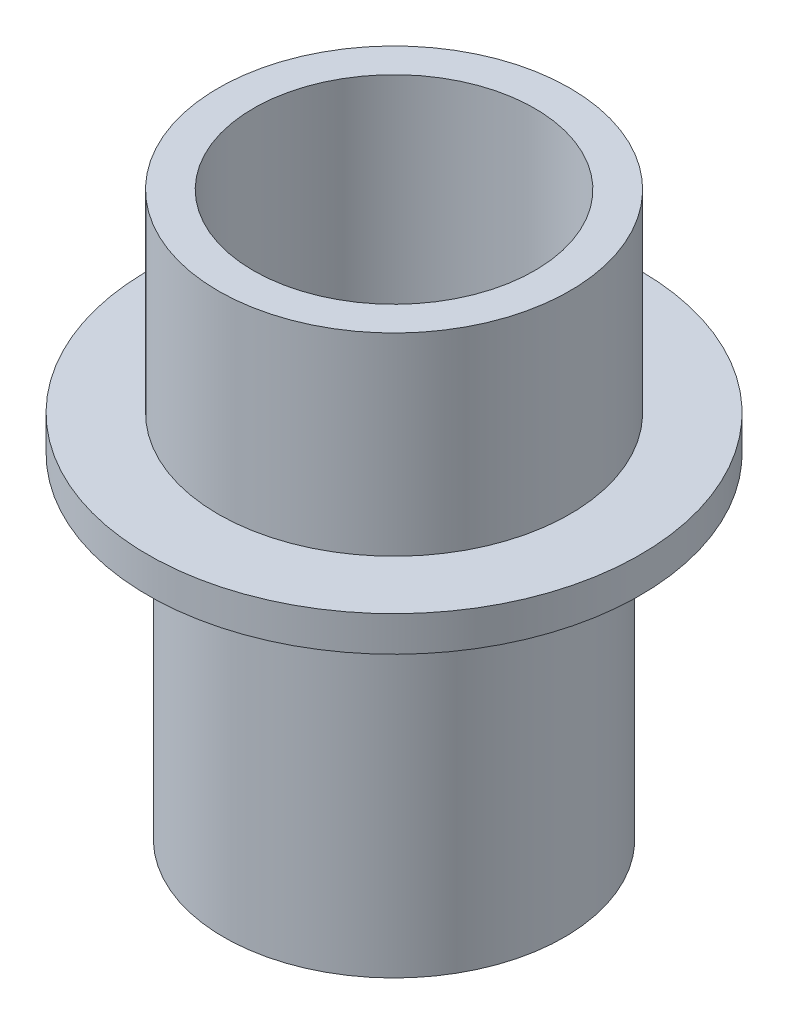
ISO-10303-21;
HEADER;
FILE_DESCRIPTION(('STEP AP214'),'2;1');
FILE_NAME('part.step','',(''),(''),'','','');
FILE_SCHEMA(('AUTOMOTIVE_DESIGN { 1 0 10303 214 1 1 1 1 }'));
ENDSEC;
DATA;
#1=APPLICATION_CONTEXT('core data for automotive mechanical design processes');
#2=APPLICATION_PROTOCOL_DEFINITION('international standard','automotive_design',2000,#1);
#3=PRODUCT_CONTEXT('',#1,'mechanical');
#4=PRODUCT('Part','Part','',(#3));
#5=PRODUCT_RELATED_PRODUCT_CATEGORY('part','',(#4));
#6=PRODUCT_DEFINITION_FORMATION('','',#4);
#7=PRODUCT_DEFINITION_CONTEXT('part definition',#1,'design');
#8=PRODUCT_DEFINITION('design','',#6,#7);
#9=PRODUCT_DEFINITION_SHAPE('','',#8);
#10=(LENGTH_UNIT() NAMED_UNIT(*) SI_UNIT(.MILLI.,.METRE.));
#11=(NAMED_UNIT(*) PLANE_ANGLE_UNIT() SI_UNIT($,.RADIAN.));
#12=(NAMED_UNIT(*) SI_UNIT($,.STERADIAN.) SOLID_ANGLE_UNIT());
#13=UNCERTAINTY_MEASURE_WITH_UNIT(LENGTH_MEASURE(1.E-05),#10,'distance_accuracy_value','');
#14=(GEOMETRIC_REPRESENTATION_CONTEXT(3) GLOBAL_UNCERTAINTY_ASSIGNED_CONTEXT((#13)) GLOBAL_UNIT_ASSIGNED_CONTEXT((#10,
#11,#12)) REPRESENTATION_CONTEXT('',''));
#15=CARTESIAN_POINT('',(0.,0.,0.));
#16=DIRECTION('',(0.,0.,1.));
#17=DIRECTION('',(1.,0.,0.));
#18=AXIS2_PLACEMENT_3D('',#15,#16,#17);
#19=CARTESIAN_POINT('',(0.,50.8,0.));
#20=DIRECTION('',(0.,-1.,0.));
#21=DIRECTION('',(0.,0.,-1.));
#22=AXIS2_PLACEMENT_3D('',#19,#20,#21);
#23=CYLINDRICAL_SURFACE('',#22,22.225);
#24=CARTESIAN_POINT('',(0.,33.3375,0.));
#25=DIRECTION('',(0.,-1.,0.));
#26=DIRECTION('',(0.,0.,-1.));
#27=AXIS2_PLACEMENT_3D('',#24,#25,#26);
#28=CIRCLE('',#27,22.225);
#29=CARTESIAN_POINT('',(0.,33.3375,-22.225));
#30=VERTEX_POINT('',#29);
#31=EDGE_CURVE('E51',#30,#30,#28,.F.);
#32=ORIENTED_EDGE('',*,*,#31,.F.);
#33=EDGE_LOOP('',(#32));
#34=FACE_BOUND('',#33,.T.);
#35=CARTESIAN_POINT('',(0.,30.1625,0.));
#36=DIRECTION('',(0.,-1.,0.));
#37=DIRECTION('',(0.,0.,-1.));
#38=AXIS2_PLACEMENT_3D('',#35,#36,#37);
#39=CIRCLE('',#38,22.225);
#40=CARTESIAN_POINT('',(0.,30.1625,-22.225));
#41=VERTEX_POINT('',#40);
#42=EDGE_CURVE('E11',#41,#41,#39,.T.);
#43=ORIENTED_EDGE('',*,*,#42,.F.);
#44=EDGE_LOOP('',(#43));
#45=FACE_BOUND('',#44,.T.);
#46=ADVANCED_FACE('F32',(#34,#45),#23,.T.);
#47=CARTESIAN_POINT('',(0.,30.1625,0.));
#48=DIRECTION('',(0.,-1.,0.));
#49=DIRECTION('',(0.,0.,-1.));
#50=AXIS2_PLACEMENT_3D('',#47,#48,#49);
#51=PLANE('',#50);
#52=CARTESIAN_POINT('',(0.,30.1625,0.));
#53=DIRECTION('',(0.,-1.,0.));
#54=DIRECTION('',(0.,0.,-1.));
#55=AXIS2_PLACEMENT_3D('',#52,#53,#54);
#56=CIRCLE('',#55,15.375);
#57=CARTESIAN_POINT('',(0.,30.1625,-15.375));
#58=VERTEX_POINT('',#57);
#59=EDGE_CURVE('E39',#58,#58,#56,.T.);
#60=ORIENTED_EDGE('',*,*,#59,.F.);
#61=EDGE_LOOP('',(#60));
#62=FACE_BOUND('',#61,.T.);
#63=ORIENTED_EDGE('',*,*,#42,.T.);
#64=EDGE_LOOP('',(#63));
#65=FACE_BOUND('',#64,.T.);
#66=ADVANCED_FACE('F101',(#62,#65),#51,.T.);
#67=CARTESIAN_POINT('',(0.,30.1625,0.));
#68=DIRECTION('',(0.,-1.,0.));
#69=DIRECTION('',(0.,0.,-1.));
#70=AXIS2_PLACEMENT_3D('',#67,#68,#69);
#71=CYLINDRICAL_SURFACE('',#70,15.375);
#72=CARTESIAN_POINT('',(0.,0.,0.));
#73=DIRECTION('',(0.,-1.,0.));
#74=DIRECTION('',(0.,0.,-1.));
#75=AXIS2_PLACEMENT_3D('',#72,#73,#74);
#76=CIRCLE('',#75,15.375);
#77=CARTESIAN_POINT('',(0.,0.,-15.375));
#78=VERTEX_POINT('',#77);
#79=EDGE_CURVE('E44',#78,#78,#76,.T.);
#80=CARTESIAN_POINT('',(0.,30.1625,-15.375));
#81=CARTESIAN_POINT('',(0.,29.8483072916667,-15.375));
#82=CARTESIAN_POINT('',(0.,29.5341145833333,-15.375));
#83=CARTESIAN_POINT('',(0.,28.9057291666667,-15.375));
#84=CARTESIAN_POINT('',(0.,28.5915364583333,-15.375));
#85=CARTESIAN_POINT('',(0.,27.9631510416667,-15.375));
#86=CARTESIAN_POINT('',(0.,27.6489583333333,-15.375));
#87=CARTESIAN_POINT('',(0.,27.0205729166667,-15.375));
#88=CARTESIAN_POINT('',(0.,26.7063802083333,-15.375));
#89=CARTESIAN_POINT('',(0.,26.0779947916667,-15.375));
#90=CARTESIAN_POINT('',(0.,25.7638020833333,-15.375));
#91=CARTESIAN_POINT('',(0.,25.1354166666667,-15.375));
#92=CARTESIAN_POINT('',(0.,24.8212239583333,-15.375));
#93=CARTESIAN_POINT('',(0.,24.1928385416667,-15.375));
#94=CARTESIAN_POINT('',(0.,23.8786458333333,-15.375));
#95=CARTESIAN_POINT('',(0.,23.2502604166667,-15.375));
#96=CARTESIAN_POINT('',(0.,22.9360677083333,-15.375));
#97=CARTESIAN_POINT('',(0.,22.3076822916667,-15.375));
#98=CARTESIAN_POINT('',(0.,21.9934895833333,-15.375));
#99=CARTESIAN_POINT('',(0.,21.3651041666667,-15.375));
#100=CARTESIAN_POINT('',(0.,21.0509114583333,-15.375));
#101=CARTESIAN_POINT('',(0.,20.4225260416667,-15.375));
#102=CARTESIAN_POINT('',(0.,20.1083333333333,-15.375));
#103=CARTESIAN_POINT('',(0.,19.4799479166667,-15.375));
#104=CARTESIAN_POINT('',(0.,19.1657552083333,-15.375));
#105=CARTESIAN_POINT('',(0.,18.5373697916667,-15.375));
#106=CARTESIAN_POINT('',(0.,18.2231770833333,-15.375));
#107=CARTESIAN_POINT('',(0.,17.5947916666667,-15.375));
#108=CARTESIAN_POINT('',(0.,17.2805989583333,-15.375));
#109=CARTESIAN_POINT('',(0.,16.6522135416667,-15.375));
#110=CARTESIAN_POINT('',(0.,16.3380208333333,-15.375));
#111=CARTESIAN_POINT('',(0.,15.7096354166667,-15.375));
#112=CARTESIAN_POINT('',(0.,15.3954427083333,-15.375));
#113=CARTESIAN_POINT('',(0.,14.7670572916667,-15.375));
#114=CARTESIAN_POINT('',(0.,14.4528645833333,-15.375));
#115=CARTESIAN_POINT('',(0.,13.8244791666667,-15.375));
#116=CARTESIAN_POINT('',(0.,13.5102864583333,-15.375));
#117=CARTESIAN_POINT('',(0.,12.8819010416667,-15.375));
#118=CARTESIAN_POINT('',(0.,12.5677083333333,-15.375));
#119=CARTESIAN_POINT('',(0.,11.9393229166667,-15.375));
#120=CARTESIAN_POINT('',(0.,11.6251302083333,-15.375));
#121=CARTESIAN_POINT('',(0.,10.9967447916667,-15.375));
#122=CARTESIAN_POINT('',(0.,10.6825520833333,-15.375));
#123=CARTESIAN_POINT('',(0.,10.0541666666667,-15.375));
#124=CARTESIAN_POINT('',(0.,9.73997395833333,-15.375));
#125=CARTESIAN_POINT('',(0.,9.11158854166667,-15.375));
#126=CARTESIAN_POINT('',(0.,8.79739583333333,-15.375));
#127=CARTESIAN_POINT('',(0.,8.16901041666667,-15.375));
#128=CARTESIAN_POINT('',(0.,7.85481770833333,-15.375));
#129=CARTESIAN_POINT('',(0.,7.22643229166667,-15.375));
#130=CARTESIAN_POINT('',(0.,6.91223958333333,-15.375));
#131=CARTESIAN_POINT('',(0.,6.28385416666667,-15.375));
#132=CARTESIAN_POINT('',(0.,5.96966145833333,-15.375));
#133=CARTESIAN_POINT('',(0.,5.34127604166667,-15.375));
#134=CARTESIAN_POINT('',(0.,5.02708333333333,-15.375));
#135=CARTESIAN_POINT('',(0.,4.39869791666667,-15.375));
#136=CARTESIAN_POINT('',(0.,4.08450520833333,-15.375));
#137=CARTESIAN_POINT('',(0.,3.45611979166667,-15.375));
#138=CARTESIAN_POINT('',(0.,3.14192708333333,-15.375));
#139=CARTESIAN_POINT('',(0.,2.51354166666667,-15.375));
#140=CARTESIAN_POINT('',(0.,2.19934895833333,-15.375));
#141=CARTESIAN_POINT('',(0.,1.57096354166667,-15.375));
#142=CARTESIAN_POINT('',(0.,1.25677083333333,-15.375));
#143=CARTESIAN_POINT('',(0.,0.628385416666666,-15.375));
#144=CARTESIAN_POINT('',(0.,0.314192708333333,-15.375));
#145=CARTESIAN_POINT('',(0.,0.,-15.375));
#146=B_SPLINE_CURVE_WITH_KNOTS('',3,(#80,#81,#82,#83,#84,#85,#86,#87,#88,#89,#90,#91,#92,#93,
#94,#95,#96,#97,#98,#99,#100,#101,#102,#103,#104,#105,#106,#107,#108,#109,#110,#111,#112,#113,
#114,#115,#116,#117,#118,#119,#120,#121,#122,#123,#124,#125,#126,#127,#128,#129,#130,#131,#132,
#133,#134,#135,#136,#137,#138,#139,#140,#141,#142,#143,#144,#145),.UNSPECIFIED.,.F.,.F.,(4,2,2,
2,2,2,2,2,2,2,2,2,2,2,2,2,2,2,2,2,2,2,2,2,2,2,2,2,2,2,2,2,4),(0.,0.942578124999999,1.88515625,
2.827734375,3.7703125,4.712890625,5.65546875,6.598046875,7.540625,8.48320312499999,9.42578125,
10.368359375,11.3109375,12.253515625,13.19609375,14.138671875,15.08125,16.023828125,16.96640625,
17.908984375,18.8515625,19.794140625,20.73671875,21.679296875,22.621875,23.564453125,
24.50703125,25.449609375,26.3921875,27.334765625,28.27734375,29.219921875,30.1625),.UNSPECIFIED.);
#147=EDGE_CURVE('BSEAM99',#58,#78,#146,.T.);
#148=ORIENTED_EDGE('',*,*,#59,.T.);
#149=ORIENTED_EDGE('',*,*,#79,.F.);
#150=ORIENTED_EDGE('',*,*,#147,.T.);
#151=ORIENTED_EDGE('',*,*,#147,.F.);
#152=EDGE_LOOP('',(#148,#150,#149,#151));
#153=FACE_BOUND('',#152,.T.);
#154=ADVANCED_FACE('F99',(#153),#71,.T.);
#155=CARTESIAN_POINT('',(0.,0.,0.));
#156=DIRECTION('',(0.,1.,0.));
#157=DIRECTION('',(0.,0.,1.));
#158=AXIS2_PLACEMENT_3D('',#155,#156,#157);
#159=PLANE('',#158);
#160=CARTESIAN_POINT('',(7.03600661923076,0.,7.18740479841529));
#161=DIRECTION('',(0.,-1.,0.));
#162=DIRECTION('',(0.,0.,-1.));
#163=AXIS2_PLACEMENT_3D('',#160,#161,#162);
#164=CIRCLE('',#163,1.70053);
#165=CARTESIAN_POINT('',(7.03600661923076,0.,5.48687479841529));
#166=VERTEX_POINT('',#165);
#167=EDGE_CURVE('E72',#166,#166,#164,.T.);
#168=ORIENTED_EDGE('',*,*,#167,.F.);
#169=EDGE_LOOP('',(#168));
#170=FACE_BOUND('',#169,.T.);
#171=CARTESIAN_POINT('',(7.15855790650721,0.,-7.10386469640412));
#172=DIRECTION('',(0.,-1.,0.));
#173=DIRECTION('',(0.,0.,-1.));
#174=AXIS2_PLACEMENT_3D('',#171,#172,#173);
#175=CIRCLE('',#174,1.70053);
#176=CARTESIAN_POINT('',(7.15855790650721,0.,-8.80439469640412));
#177=VERTEX_POINT('',#176);
#178=EDGE_CURVE('E62',#177,#177,#175,.T.);
#179=ORIENTED_EDGE('',*,*,#178,.F.);
#180=EDGE_LOOP('',(#179));
#181=FACE_BOUND('',#180,.T.);
#182=CARTESIAN_POINT('',(-7.16289906571888,0.,-6.97003168070864));
#183=DIRECTION('',(0.,-1.,0.));
#184=DIRECTION('',(0.,0.,-1.));
#185=AXIS2_PLACEMENT_3D('',#182,#183,#184);
#186=CIRCLE('',#185,1.70053);
#187=CARTESIAN_POINT('',(-7.16289906571888,0.,-8.67056168070864));
#188=VERTEX_POINT('',#187);
#189=EDGE_CURVE('E59',#188,#188,#186,.T.);
#190=ORIENTED_EDGE('',*,*,#189,.F.);
#191=EDGE_LOOP('',(#190));
#192=FACE_BOUND('',#191,.T.);
#193=CARTESIAN_POINT('',(-7.07105366972985,0.,7.07105366972985));
#194=DIRECTION('',(0.,-1.,0.));
#195=DIRECTION('',(0.,0.,-1.));
#196=AXIS2_PLACEMENT_3D('',#193,#194,#195);
#197=CIRCLE('',#196,1.70053);
#198=CARTESIAN_POINT('',(-7.07105366972985,0.,5.37052366972985));
#199=VERTEX_POINT('',#198);
#200=EDGE_CURVE('E56',#199,#199,#197,.T.);
#201=ORIENTED_EDGE('',*,*,#200,.F.);
#202=EDGE_LOOP('',(#201));
#203=FACE_BOUND('',#202,.T.);
#204=CARTESIAN_POINT('',(0.,0.,0.));
#205=DIRECTION('',(0.,-1.,0.));
#206=DIRECTION('',(0.,0.,-1.));
#207=AXIS2_PLACEMENT_3D('',#204,#205,#206);
#208=CIRCLE('',#207,8.001);
#209=CARTESIAN_POINT('',(0.,0.,-8.001));
#210=VERTEX_POINT('',#209);
#211=EDGE_CURVE('E52',#210,#210,#208,.T.);
#212=ORIENTED_EDGE('',*,*,#211,.F.);
#213=EDGE_LOOP('',(#212));
#214=FACE_BOUND('',#213,.T.);
#215=ORIENTED_EDGE('',*,*,#79,.T.);
#216=EDGE_LOOP('',(#215));
#217=FACE_BOUND('',#216,.T.);
#218=ADVANCED_FACE('F97',(#170,#181,#192,#203,#214,#217),#159,.F.);
#219=CARTESIAN_POINT('',(0.,-32.6992928474841,0.));
#220=DIRECTION('',(0.,1.,0.));
#221=DIRECTION('',(0.,0.,1.));
#222=AXIS2_PLACEMENT_3D('',#219,#220,#221);
#223=CYLINDRICAL_SURFACE('',#222,15.875);
#224=CARTESIAN_POINT('',(0.,50.8,0.));
#225=DIRECTION('',(0.,1.,0.));
#226=DIRECTION('',(0.,0.,1.));
#227=AXIS2_PLACEMENT_3D('',#224,#225,#226);
#228=CIRCLE('',#227,15.875);
#229=CARTESIAN_POINT('',(0.,50.8,15.875));
#230=VERTEX_POINT('',#229);
#231=EDGE_CURVE('E79',#230,#230,#228,.T.);
#232=ORIENTED_EDGE('',*,*,#231,.F.);
#233=EDGE_LOOP('',(#232));
#234=FACE_BOUND('',#233,.T.);
#235=CARTESIAN_POINT('',(0.,33.3375,0.));
#236=DIRECTION('',(0.,-1.,0.));
#237=DIRECTION('',(0.,0.,-1.));
#238=AXIS2_PLACEMENT_3D('',#235,#236,#237);
#239=CIRCLE('',#238,15.875);
#240=CARTESIAN_POINT('',(0.,33.3375,-15.875));
#241=VERTEX_POINT('',#240);
#242=EDGE_CURVE('E82',#241,#241,#239,.F.);
#243=ORIENTED_EDGE('',*,*,#242,.T.);
#244=EDGE_LOOP('',(#243));
#245=FACE_BOUND('',#244,.T.);
#246=ADVANCED_FACE('F108',(#234,#245),#223,.T.);
#247=CARTESIAN_POINT('',(0.,33.3375,0.));
#248=DIRECTION('',(0.,-1.,0.));
#249=DIRECTION('',(0.,0.,-1.));
#250=AXIS2_PLACEMENT_3D('',#247,#248,#249);
#251=PLANE('',#250);
#252=ORIENTED_EDGE('',*,*,#31,.T.);
#253=EDGE_LOOP('',(#252));
#254=FACE_BOUND('',#253,.T.);
#255=ORIENTED_EDGE('',*,*,#242,.F.);
#256=EDGE_LOOP('',(#255));
#257=FACE_BOUND('',#256,.T.);
#258=ADVANCED_FACE('F120',(#254,#257),#251,.F.);
#259=CARTESIAN_POINT('',(0.,1.5875,0.));
#260=DIRECTION('',(0.,1.,0.));
#261=DIRECTION('',(0.,0.,1.));
#262=AXIS2_PLACEMENT_3D('',#259,#260,#261);
#263=PLANE('',#262);
#264=CARTESIAN_POINT('',(7.03600661923076,1.5875,7.18740479841529));
#265=DIRECTION('',(0.,1.,0.));
#266=DIRECTION('',(0.,0.,1.));
#267=AXIS2_PLACEMENT_3D('',#264,#265,#266);
#268=CIRCLE('',#267,1.70053);
#269=CARTESIAN_POINT('',(7.03600661923076,1.5875,8.88793479841529));
#270=VERTEX_POINT('',#269);
#271=EDGE_CURVE('E35',#270,#270,#268,.T.);
#272=ORIENTED_EDGE('',*,*,#271,.F.);
#273=EDGE_LOOP('',(#272));
#274=FACE_BOUND('',#273,.T.);
#275=CARTESIAN_POINT('',(7.15855790650721,1.5875,-7.10386469640412));
#276=DIRECTION('',(0.,1.,0.));
#277=DIRECTION('',(0.,0.,1.));
#278=AXIS2_PLACEMENT_3D('',#275,#276,#277);
#279=CIRCLE('',#278,1.70053);
#280=CARTESIAN_POINT('',(7.15855790650721,1.5875,-5.40333469640411));
#281=VERTEX_POINT('',#280);
#282=EDGE_CURVE('E60',#281,#281,#279,.T.);
#283=ORIENTED_EDGE('',*,*,#282,.F.);
#284=EDGE_LOOP('',(#283));
#285=FACE_BOUND('',#284,.T.);
#286=CARTESIAN_POINT('',(-7.16289906571888,1.5875,-6.97003168070864));
#287=DIRECTION('',(0.,1.,0.));
#288=DIRECTION('',(0.,0.,1.));
#289=AXIS2_PLACEMENT_3D('',#286,#287,#288);
#290=CIRCLE('',#289,1.70053);
#291=CARTESIAN_POINT('',(-7.16289906571888,1.5875,-5.26950168070864));
#292=VERTEX_POINT('',#291);
#293=EDGE_CURVE('E57',#292,#292,#290,.T.);
#294=ORIENTED_EDGE('',*,*,#293,.F.);
#295=EDGE_LOOP('',(#294));
#296=FACE_BOUND('',#295,.T.);
#297=CARTESIAN_POINT('',(-7.07105366972985,1.5875,7.07105366972985));
#298=DIRECTION('',(0.,1.,0.));
#299=DIRECTION('',(0.,0.,1.));
#300=AXIS2_PLACEMENT_3D('',#297,#298,#299);
#301=CIRCLE('',#300,1.70053);
#302=CARTESIAN_POINT('',(-7.07105366972985,1.5875,8.77158366972985));
#303=VERTEX_POINT('',#302);
#304=EDGE_CURVE('E53',#303,#303,#301,.T.);
#305=ORIENTED_EDGE('',*,*,#304,.F.);
#306=EDGE_LOOP('',(#305));
#307=FACE_BOUND('',#306,.T.);
#308=CARTESIAN_POINT('',(0.,1.5875,0.));
#309=DIRECTION('',(0.,1.,0.));
#310=DIRECTION('',(0.,0.,1.));
#311=AXIS2_PLACEMENT_3D('',#308,#309,#310);
#312=CIRCLE('',#311,8.001);
#313=CARTESIAN_POINT('',(0.,1.5875,8.001));
#314=VERTEX_POINT('',#313);
#315=EDGE_CURVE('E48',#314,#314,#312,.T.);
#316=ORIENTED_EDGE('',*,*,#315,.F.);
#317=EDGE_LOOP('',(#316));
#318=FACE_BOUND('',#317,.T.);
#319=CARTESIAN_POINT('',(0.,1.5875,0.));
#320=DIRECTION('',(0.,1.,0.));
#321=DIRECTION('',(0.,0.,1.));
#322=AXIS2_PLACEMENT_3D('',#319,#320,#321);
#323=CIRCLE('',#322,12.7);
#324=CARTESIAN_POINT('',(0.,1.5875,12.7));
#325=VERTEX_POINT('',#324);
#326=EDGE_CURVE('E90',#325,#325,#323,.F.);
#327=ORIENTED_EDGE('',*,*,#326,.F.);
#328=EDGE_LOOP('',(#327));
#329=FACE_BOUND('',#328,.T.);
#330=ADVANCED_FACE('F123',(#274,#285,#296,#307,#318,#329),#263,.T.);
#331=CARTESIAN_POINT('',(0.,-35.9210244842766,0.));
#332=DIRECTION('',(0.,1.,0.));
#333=DIRECTION('',(0.,0.,1.));
#334=AXIS2_PLACEMENT_3D('',#331,#332,#333);
#335=CYLINDRICAL_SURFACE('',#334,12.7);
#336=CARTESIAN_POINT('',(0.,50.8,0.));
#337=DIRECTION('',(0.,1.,0.));
#338=DIRECTION('',(0.,0.,1.));
#339=AXIS2_PLACEMENT_3D('',#336,#337,#338);
#340=CIRCLE('',#339,12.7);
#341=CARTESIAN_POINT('',(0.,50.8,12.7));
#342=VERTEX_POINT('',#341);
#343=EDGE_CURVE('E87',#342,#342,#340,.T.);
#344=CARTESIAN_POINT('',(0.,1.5875,12.7));
#345=CARTESIAN_POINT('',(0.,2.10013020833333,12.7));
#346=CARTESIAN_POINT('',(0.,2.61276041666666,12.7));
#347=CARTESIAN_POINT('',(0.,3.63802083333333,12.7));
#348=CARTESIAN_POINT('',(0.,4.15065104166666,12.7));
#349=CARTESIAN_POINT('',(0.,5.17591145833333,12.7));
#350=CARTESIAN_POINT('',(0.,5.68854166666667,12.7));
#351=CARTESIAN_POINT('',(0.,6.71380208333333,12.7));
#352=CARTESIAN_POINT('',(0.,7.22643229166667,12.7));
#353=CARTESIAN_POINT('',(0.,8.25169270833333,12.7));
#354=CARTESIAN_POINT('',(0.,8.76432291666666,12.7));
#355=CARTESIAN_POINT('',(0.,9.78958333333333,12.7));
#356=CARTESIAN_POINT('',(0.,10.3022135416667,12.7));
#357=CARTESIAN_POINT('',(0.,11.3274739583333,12.7));
#358=CARTESIAN_POINT('',(0.,11.8401041666667,12.7));
#359=CARTESIAN_POINT('',(0.,12.8653645833333,12.7));
#360=CARTESIAN_POINT('',(0.,13.3779947916667,12.7));
#361=CARTESIAN_POINT('',(0.,14.4032552083333,12.7));
#362=CARTESIAN_POINT('',(0.,14.9158854166667,12.7));
#363=CARTESIAN_POINT('',(0.,15.9411458333333,12.7));
#364=CARTESIAN_POINT('',(0.,16.4537760416667,12.7));
#365=CARTESIAN_POINT('',(0.,17.4790364583333,12.7));
#366=CARTESIAN_POINT('',(0.,17.9916666666667,12.7));
#367=CARTESIAN_POINT('',(0.,19.0169270833333,12.7));
#368=CARTESIAN_POINT('',(0.,19.5295572916667,12.7));
#369=CARTESIAN_POINT('',(0.,20.5548177083333,12.7));
#370=CARTESIAN_POINT('',(0.,21.0674479166667,12.7));
#371=CARTESIAN_POINT('',(0.,22.0927083333333,12.7));
#372=CARTESIAN_POINT('',(0.,22.6053385416667,12.7));
#373=CARTESIAN_POINT('',(0.,23.6305989583333,12.7));
#374=CARTESIAN_POINT('',(0.,24.1432291666667,12.7));
#375=CARTESIAN_POINT('',(0.,25.1684895833333,12.7));
#376=CARTESIAN_POINT('',(0.,25.6811197916667,12.7));
#377=CARTESIAN_POINT('',(0.,26.7063802083333,12.7));
#378=CARTESIAN_POINT('',(0.,27.2190104166667,12.7));
#379=CARTESIAN_POINT('',(0.,28.2442708333333,12.7));
#380=CARTESIAN_POINT('',(0.,28.7569010416666,12.7));
#381=CARTESIAN_POINT('',(0.,29.7821614583333,12.7));
#382=CARTESIAN_POINT('',(0.,30.2947916666667,12.7));
#383=CARTESIAN_POINT('',(0.,31.3200520833333,12.7));
#384=CARTESIAN_POINT('',(0.,31.8326822916667,12.7));
#385=CARTESIAN_POINT('',(0.,32.8579427083333,12.7));
#386=CARTESIAN_POINT('',(0.,33.3705729166667,12.7));
#387=CARTESIAN_POINT('',(0.,34.3958333333333,12.7));
#388=CARTESIAN_POINT('',(0.,34.9084635416667,12.7));
#389=CARTESIAN_POINT('',(0.,35.9337239583333,12.7));
#390=CARTESIAN_POINT('',(0.,36.4463541666667,12.7));
#391=CARTESIAN_POINT('',(0.,37.4716145833333,12.7));
#392=CARTESIAN_POINT('',(0.,37.9842447916667,12.7));
#393=CARTESIAN_POINT('',(0.,39.0095052083333,12.7));
#394=CARTESIAN_POINT('',(0.,39.5221354166667,12.7));
#395=CARTESIAN_POINT('',(0.,40.5473958333333,12.7));
#396=CARTESIAN_POINT('',(0.,41.0600260416666,12.7));
#397=CARTESIAN_POINT('',(0.,42.0852864583333,12.7));
#398=CARTESIAN_POINT('',(0.,42.5979166666666,12.7));
#399=CARTESIAN_POINT('',(0.,43.6231770833333,12.7));
#400=CARTESIAN_POINT('',(0.,44.1358072916667,12.7));
#401=CARTESIAN_POINT('',(0.,45.1610677083333,12.7));
#402=CARTESIAN_POINT('',(0.,45.6736979166667,12.7));
#403=CARTESIAN_POINT('',(0.,46.6989583333333,12.7));
#404=CARTESIAN_POINT('',(0.,47.2115885416667,12.7));
#405=CARTESIAN_POINT('',(0.,48.2368489583333,12.7));
#406=CARTESIAN_POINT('',(0.,48.7494791666667,12.7));
#407=CARTESIAN_POINT('',(0.,49.7747395833333,12.7));
#408=CARTESIAN_POINT('',(0.,50.2873697916667,12.7));
#409=CARTESIAN_POINT('',(0.,50.8,12.7));
#410=B_SPLINE_CURVE_WITH_KNOTS('',3,(#344,#345,#346,#347,#348,#349,#350,#351,#352,#353,#354,
#355,#356,#357,#358,#359,#360,#361,#362,#363,#364,#365,#366,#367,#368,#369,#370,#371,#372,#373,
#374,#375,#376,#377,#378,#379,#380,#381,#382,#383,#384,#385,#386,#387,#388,#389,#390,#391,#392,
#393,#394,#395,#396,#397,#398,#399,#400,#401,#402,#403,#404,#405,#406,#407,#408,#409),
.UNSPECIFIED.,.F.,.F.,(4,2,2,2,2,2,2,2,2,2,2,2,2,2,2,2,2,2,2,2,2,2,2,2,2,2,2,2,2,2,2,2,4),(0.,
1.537890625,3.07578125,4.613671875,6.1515625,7.689453125,9.22734375,10.765234375,12.303125,
13.841015625,15.37890625,16.916796875,18.4546875,19.992578125,21.53046875,23.068359375,24.60625,
26.144140625,27.68203125,29.219921875,30.7578125,32.295703125,33.83359375,35.371484375,
36.909375,38.447265625,39.98515625,41.523046875,43.0609375,44.598828125,46.13671875,
47.674609375,49.2125),.UNSPECIFIED.);
#411=EDGE_CURVE('BSEAM138',#325,#342,#410,.T.);
#412=ORIENTED_EDGE('',*,*,#326,.T.);
#413=ORIENTED_EDGE('',*,*,#343,.T.);
#414=ORIENTED_EDGE('',*,*,#411,.T.);
#415=ORIENTED_EDGE('',*,*,#411,.F.);
#416=EDGE_LOOP('',(#412,#414,#413,#415));
#417=FACE_BOUND('',#416,.T.);
#418=ADVANCED_FACE('F138',(#417),#335,.F.);
#419=CARTESIAN_POINT('',(0.,50.8,0.));
#420=DIRECTION('',(0.,1.,0.));
#421=DIRECTION('',(0.,0.,1.));
#422=AXIS2_PLACEMENT_3D('',#419,#420,#421);
#423=PLANE('',#422);
#424=ORIENTED_EDGE('',*,*,#343,.F.);
#425=EDGE_LOOP('',(#424));
#426=FACE_BOUND('',#425,.T.);
#427=ORIENTED_EDGE('',*,*,#231,.T.);
#428=EDGE_LOOP('',(#427));
#429=FACE_BOUND('',#428,.T.);
#430=ADVANCED_FACE('F141',(#426,#429),#423,.T.);
#431=CARTESIAN_POINT('',(0.,50.8,0.));
#432=DIRECTION('',(0.,-1.,0.));
#433=DIRECTION('',(0.,0.,-1.));
#434=AXIS2_PLACEMENT_3D('',#431,#432,#433);
#435=CYLINDRICAL_SURFACE('',#434,8.001);
#436=ORIENTED_EDGE('',*,*,#315,.T.);
#437=EDGE_LOOP('',(#436));
#438=FACE_BOUND('',#437,.T.);
#439=ORIENTED_EDGE('',*,*,#211,.T.);
#440=EDGE_LOOP('',(#439));
#441=FACE_BOUND('',#440,.T.);
#442=ADVANCED_FACE('F134',(#438,#441),#435,.F.);
#443=CARTESIAN_POINT('',(-7.07105366972985,50.8,7.07105366972985));
#444=DIRECTION('',(0.,-1.,0.));
#445=DIRECTION('',(0.,0.,-1.));
#446=AXIS2_PLACEMENT_3D('',#443,#444,#445);
#447=CYLINDRICAL_SURFACE('',#446,1.70053);
#448=ORIENTED_EDGE('',*,*,#304,.T.);
#449=EDGE_LOOP('',(#448));
#450=FACE_BOUND('',#449,.T.);
#451=ORIENTED_EDGE('',*,*,#200,.T.);
#452=EDGE_LOOP('',(#451));
#453=FACE_BOUND('',#452,.T.);
#454=ADVANCED_FACE('F153',(#450,#453),#447,.F.);
#455=CARTESIAN_POINT('',(-7.16289906571888,50.8,-6.97003168070864));
#456=DIRECTION('',(0.,-1.,0.));
#457=DIRECTION('',(0.,0.,-1.));
#458=AXIS2_PLACEMENT_3D('',#455,#456,#457);
#459=CYLINDRICAL_SURFACE('',#458,1.70053);
#460=ORIENTED_EDGE('',*,*,#293,.T.);
#461=EDGE_LOOP('',(#460));
#462=FACE_BOUND('',#461,.T.);
#463=ORIENTED_EDGE('',*,*,#189,.T.);
#464=EDGE_LOOP('',(#463));
#465=FACE_BOUND('',#464,.T.);
#466=ADVANCED_FACE('F158',(#462,#465),#459,.F.);
#467=CARTESIAN_POINT('',(7.15855790650721,50.8,-7.10386469640412));
#468=DIRECTION('',(0.,-1.,0.));
#469=DIRECTION('',(0.,0.,-1.));
#470=AXIS2_PLACEMENT_3D('',#467,#468,#469);
#471=CYLINDRICAL_SURFACE('',#470,1.70053);
#472=ORIENTED_EDGE('',*,*,#282,.T.);
#473=EDGE_LOOP('',(#472));
#474=FACE_BOUND('',#473,.T.);
#475=ORIENTED_EDGE('',*,*,#178,.T.);
#476=EDGE_LOOP('',(#475));
#477=FACE_BOUND('',#476,.T.);
#478=ADVANCED_FACE('F169',(#474,#477),#471,.F.);
#479=CARTESIAN_POINT('',(7.03600661923076,50.8,7.18740479841529));
#480=DIRECTION('',(0.,-1.,0.));
#481=DIRECTION('',(0.,0.,-1.));
#482=AXIS2_PLACEMENT_3D('',#479,#480,#481);
#483=CYLINDRICAL_SURFACE('',#482,1.70053);
#484=ORIENTED_EDGE('',*,*,#271,.T.);
#485=EDGE_LOOP('',(#484));
#486=FACE_BOUND('',#485,.T.);
#487=ORIENTED_EDGE('',*,*,#167,.T.);
#488=EDGE_LOOP('',(#487));
#489=FACE_BOUND('',#488,.T.);
#490=ADVANCED_FACE('F176',(#486,#489),#483,.F.);
#491=CLOSED_SHELL('',(#46,#66,#154,#218,#246,#258,#330,#418,#430,#442,#454,#466,#478,#490));
#492=MANIFOLD_SOLID_BREP('B2',#491);
#493=ADVANCED_BREP_SHAPE_REPRESENTATION('',(#18,#492),#14);
#494=SHAPE_DEFINITION_REPRESENTATION(#9,#493);
ENDSEC;
END-ISO-10303-21;
